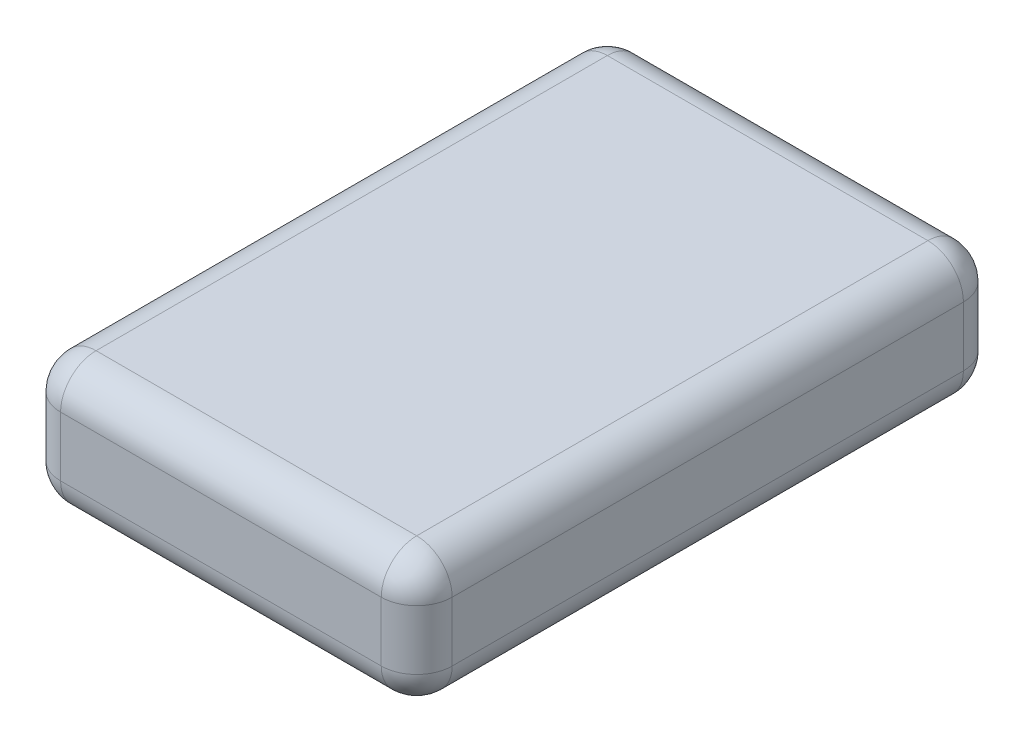
ISO-10303-21;
HEADER;
FILE_DESCRIPTION(('STEP AP214'),'2;1');
FILE_NAME('part.step','',(''),(''),'','','');
FILE_SCHEMA(('AUTOMOTIVE_DESIGN { 1 0 10303 214 1 1 1 1 }'));
ENDSEC;
DATA;
#1=APPLICATION_CONTEXT('core data for automotive mechanical design processes');
#2=APPLICATION_PROTOCOL_DEFINITION('international standard','automotive_design',2000,#1);
#3=PRODUCT_CONTEXT('',#1,'mechanical');
#4=PRODUCT('Part','Part','',(#3));
#5=PRODUCT_RELATED_PRODUCT_CATEGORY('part','',(#4));
#6=PRODUCT_DEFINITION_FORMATION('','',#4);
#7=PRODUCT_DEFINITION_CONTEXT('part definition',#1,'design');
#8=PRODUCT_DEFINITION('design','',#6,#7);
#9=PRODUCT_DEFINITION_SHAPE('','',#8);
#10=(LENGTH_UNIT() NAMED_UNIT(*) SI_UNIT(.MILLI.,.METRE.));
#11=(NAMED_UNIT(*) PLANE_ANGLE_UNIT() SI_UNIT($,.RADIAN.));
#12=(NAMED_UNIT(*) SI_UNIT($,.STERADIAN.) SOLID_ANGLE_UNIT());
#13=UNCERTAINTY_MEASURE_WITH_UNIT(LENGTH_MEASURE(1.E-05),#10,'distance_accuracy_value','');
#14=(GEOMETRIC_REPRESENTATION_CONTEXT(3) GLOBAL_UNCERTAINTY_ASSIGNED_CONTEXT((#13)) GLOBAL_UNIT_ASSIGNED_CONTEXT((#10,
#11,#12)) REPRESENTATION_CONTEXT('',''));
#15=CARTESIAN_POINT('',(0.,0.,0.));
#16=DIRECTION('',(0.,0.,1.));
#17=DIRECTION('',(1.,0.,0.));
#18=AXIS2_PLACEMENT_3D('',#15,#16,#17);
#19=CARTESIAN_POINT('',(8.28,5.52,12.31));
#20=DIRECTION('',(-1.,0.,0.));
#21=DIRECTION('',(0.,0.,1.));
#22=AXIS2_PLACEMENT_3D('',#19,#20,#21);
#23=PLANE('',#22);
#24=DIRECTION('',(0.,-1.,0.));
#25=VECTOR('',#24,1.);
#26=CARTESIAN_POINT('',(8.28,5.52,10.81));
#27=LINE('',#26,#25);
#28=CARTESIAN_POINT('',(8.28,4.02,10.81));
#29=VERTEX_POINT('',#28);
#30=CARTESIAN_POINT('',(8.28,1.5,10.81));
#31=VERTEX_POINT('',#30);
#32=EDGE_CURVE('E329',#29,#31,#27,.T.);
#33=ORIENTED_EDGE('',*,*,#32,.T.);
#34=DIRECTION('',(0.,0.,-1.));
#35=VECTOR('',#34,1.);
#36=CARTESIAN_POINT('',(8.28,1.5,-12.31));
#37=LINE('',#36,#35);
#38=CARTESIAN_POINT('',(8.28,1.5,-10.81));
#39=VERTEX_POINT('',#38);
#40=EDGE_CURVE('E241',#31,#39,#37,.T.);
#41=ORIENTED_EDGE('',*,*,#40,.T.);
#42=DIRECTION('',(0.,-1.,0.));
#43=VECTOR('',#42,1.);
#44=CARTESIAN_POINT('',(8.28,5.52,-10.81));
#45=LINE('',#44,#43);
#46=CARTESIAN_POINT('',(8.28,4.02,-10.81));
#47=VERTEX_POINT('',#46);
#48=EDGE_CURVE('E335',#39,#47,#45,.F.);
#49=ORIENTED_EDGE('',*,*,#48,.T.);
#50=DIRECTION('',(0.,0.,-1.));
#51=VECTOR('',#50,1.);
#52=CARTESIAN_POINT('',(8.28,4.02,12.31));
#53=LINE('',#52,#51);
#54=EDGE_CURVE('E324',#47,#29,#53,.F.);
#55=ORIENTED_EDGE('',*,*,#54,.T.);
#56=EDGE_LOOP('',(#33,#41,#49,#55));
#57=FACE_BOUND('',#56,.T.);
#58=ADVANCED_FACE('F38',(#57),#23,.F.);
#59=CARTESIAN_POINT('',(-8.28,5.52,-12.31));
#60=DIRECTION('',(0.,0.,1.));
#61=DIRECTION('',(1.,0.,0.));
#62=AXIS2_PLACEMENT_3D('',#59,#60,#61);
#63=PLANE('',#62);
#64=DIRECTION('',(0.,-1.,0.));
#65=VECTOR('',#64,1.);
#66=CARTESIAN_POINT('',(6.78,5.52,-12.31));
#67=LINE('',#66,#65);
#68=CARTESIAN_POINT('',(6.78,4.02,-12.31));
#69=VERTEX_POINT('',#68);
#70=CARTESIAN_POINT('',(6.78,1.5,-12.31));
#71=VERTEX_POINT('',#70);
#72=EDGE_CURVE('E138',#69,#71,#67,.T.);
#73=ORIENTED_EDGE('',*,*,#72,.T.);
#74=DIRECTION('',(-1.,0.,0.));
#75=VECTOR('',#74,1.);
#76=CARTESIAN_POINT('',(-8.28,1.5,-12.31));
#77=LINE('',#76,#75);
#78=CARTESIAN_POINT('',(-6.78,1.5,-12.31));
#79=VERTEX_POINT('',#78);
#80=EDGE_CURVE('E133',#71,#79,#77,.T.);
#81=ORIENTED_EDGE('',*,*,#80,.T.);
#82=DIRECTION('',(0.,-1.,0.));
#83=VECTOR('',#82,1.);
#84=CARTESIAN_POINT('',(-6.78,5.52,-12.31));
#85=LINE('',#84,#83);
#86=CARTESIAN_POINT('',(-6.78,4.02,-12.31));
#87=VERTEX_POINT('',#86);
#88=EDGE_CURVE('E127',#79,#87,#85,.F.);
#89=ORIENTED_EDGE('',*,*,#88,.T.);
#90=DIRECTION('',(-1.,0.,0.));
#91=VECTOR('',#90,1.);
#92=CARTESIAN_POINT('',(-8.28,4.02,-12.31));
#93=LINE('',#92,#91);
#94=EDGE_CURVE('E130',#87,#69,#93,.F.);
#95=ORIENTED_EDGE('',*,*,#94,.T.);
#96=EDGE_LOOP('',(#73,#81,#89,#95));
#97=FACE_BOUND('',#96,.T.);
#98=ADVANCED_FACE('F129',(#97),#63,.F.);
#99=CARTESIAN_POINT('',(-8.28,5.52,12.31));
#100=DIRECTION('',(1.,0.,0.));
#101=DIRECTION('',(0.,0.,-1.));
#102=AXIS2_PLACEMENT_3D('',#99,#100,#101);
#103=PLANE('',#102);
#104=DIRECTION('',(0.,0.,1.));
#105=VECTOR('',#104,1.);
#106=CARTESIAN_POINT('',(-8.28,1.5,12.31));
#107=LINE('',#106,#105);
#108=CARTESIAN_POINT('',(-8.28,1.5,-10.81));
#109=VERTEX_POINT('',#108);
#110=CARTESIAN_POINT('',(-8.28,1.5,10.81));
#111=VERTEX_POINT('',#110);
#112=EDGE_CURVE('E256',#109,#111,#107,.T.);
#113=ORIENTED_EDGE('',*,*,#112,.T.);
#114=DIRECTION('',(0.,-1.,0.));
#115=VECTOR('',#114,1.);
#116=CARTESIAN_POINT('',(-8.28,5.52,10.81));
#117=LINE('',#116,#115);
#118=CARTESIAN_POINT('',(-8.28,4.02,10.81));
#119=VERTEX_POINT('',#118);
#120=EDGE_CURVE('E267',#111,#119,#117,.F.);
#121=ORIENTED_EDGE('',*,*,#120,.T.);
#122=DIRECTION('',(0.,0.,1.));
#123=VECTOR('',#122,1.);
#124=CARTESIAN_POINT('',(-8.28,4.02,12.31));
#125=LINE('',#124,#123);
#126=CARTESIAN_POINT('',(-8.28,4.02,-10.81));
#127=VERTEX_POINT('',#126);
#128=EDGE_CURVE('E264',#119,#127,#125,.F.);
#129=ORIENTED_EDGE('',*,*,#128,.T.);
#130=DIRECTION('',(0.,-1.,0.));
#131=VECTOR('',#130,1.);
#132=CARTESIAN_POINT('',(-8.28,5.52,-10.81));
#133=LINE('',#132,#131);
#134=EDGE_CURVE('E161',#127,#109,#133,.T.);
#135=ORIENTED_EDGE('',*,*,#134,.T.);
#136=EDGE_LOOP('',(#113,#121,#129,#135));
#137=FACE_BOUND('',#136,.T.);
#138=ADVANCED_FACE('F368',(#137),#103,.F.);
#139=CARTESIAN_POINT('',(-8.28,5.52,12.31));
#140=DIRECTION('',(0.,0.,-1.));
#141=DIRECTION('',(-1.,0.,0.));
#142=AXIS2_PLACEMENT_3D('',#139,#140,#141);
#143=PLANE('',#142);
#144=DIRECTION('',(0.,-1.,0.));
#145=VECTOR('',#144,1.);
#146=CARTESIAN_POINT('',(-6.78,5.52,12.31));
#147=LINE('',#146,#145);
#148=CARTESIAN_POINT('',(-6.78,4.02,12.31));
#149=VERTEX_POINT('',#148);
#150=CARTESIAN_POINT('',(-6.78,1.5,12.31));
#151=VERTEX_POINT('',#150);
#152=EDGE_CURVE('E240',#149,#151,#147,.T.);
#153=ORIENTED_EDGE('',*,*,#152,.T.);
#154=DIRECTION('',(1.,0.,0.));
#155=VECTOR('',#154,1.);
#156=CARTESIAN_POINT('',(8.28,1.5,12.31));
#157=LINE('',#156,#155);
#158=CARTESIAN_POINT('',(6.78,1.5,12.31));
#159=VERTEX_POINT('',#158);
#160=EDGE_CURVE('E247',#151,#159,#157,.T.);
#161=ORIENTED_EDGE('',*,*,#160,.T.);
#162=DIRECTION('',(0.,-1.,0.));
#163=VECTOR('',#162,1.);
#164=CARTESIAN_POINT('',(6.78,5.52,12.31));
#165=LINE('',#164,#163);
#166=CARTESIAN_POINT('',(6.78,4.02,12.31));
#167=VERTEX_POINT('',#166);
#168=EDGE_CURVE('E244',#159,#167,#165,.F.);
#169=ORIENTED_EDGE('',*,*,#168,.T.);
#170=DIRECTION('',(1.,0.,0.));
#171=VECTOR('',#170,1.);
#172=CARTESIAN_POINT('',(-8.28,4.02,12.31));
#173=LINE('',#172,#171);
#174=EDGE_CURVE('E236',#167,#149,#173,.F.);
#175=ORIENTED_EDGE('',*,*,#174,.T.);
#176=EDGE_LOOP('',(#153,#161,#169,#175));
#177=FACE_BOUND('',#176,.T.);
#178=ADVANCED_FACE('F245',(#177),#143,.F.);
#179=CARTESIAN_POINT('',(0.,5.52,0.));
#180=DIRECTION('',(0.,-1.,0.));
#181=DIRECTION('',(0.,0.,-1.));
#182=AXIS2_PLACEMENT_3D('',#179,#180,#181);
#183=PLANE('',#182);
#184=DIRECTION('',(-1.,0.,0.));
#185=VECTOR('',#184,1.);
#186=CARTESIAN_POINT('',(0.,5.52,-10.81));
#187=LINE('',#186,#185);
#188=CARTESIAN_POINT('',(6.78,5.52,-10.81));
#189=VERTEX_POINT('',#188);
#190=CARTESIAN_POINT('',(-6.78,5.52,-10.81));
#191=VERTEX_POINT('',#190);
#192=EDGE_CURVE('E48',#189,#191,#187,.T.);
#193=ORIENTED_EDGE('',*,*,#192,.T.);
#194=DIRECTION('',(0.,0.,1.));
#195=VECTOR('',#194,1.);
#196=CARTESIAN_POINT('',(-6.78,5.52,0.));
#197=LINE('',#196,#195);
#198=CARTESIAN_POINT('',(-6.78,5.52,10.81));
#199=VERTEX_POINT('',#198);
#200=EDGE_CURVE('E11',#191,#199,#197,.T.);
#201=ORIENTED_EDGE('',*,*,#200,.T.);
#202=DIRECTION('',(1.,0.,0.));
#203=VECTOR('',#202,1.);
#204=CARTESIAN_POINT('',(0.,5.52,10.81));
#205=LINE('',#204,#203);
#206=CARTESIAN_POINT('',(6.78,5.52,10.81));
#207=VERTEX_POINT('',#206);
#208=EDGE_CURVE('E271',#199,#207,#205,.T.);
#209=ORIENTED_EDGE('',*,*,#208,.T.);
#210=DIRECTION('',(0.,0.,-1.));
#211=VECTOR('',#210,1.);
#212=CARTESIAN_POINT('',(6.78,5.52,0.));
#213=LINE('',#212,#211);
#214=EDGE_CURVE('E59',#207,#189,#213,.T.);
#215=ORIENTED_EDGE('',*,*,#214,.T.);
#216=EDGE_LOOP('',(#193,#201,#209,#215));
#217=FACE_BOUND('',#216,.T.);
#218=ADVANCED_FACE('F439',(#217),#183,.F.);
#219=CARTESIAN_POINT('',(0.,0.,0.));
#220=DIRECTION('',(0.,-1.,0.));
#221=DIRECTION('',(0.,0.,-1.));
#222=AXIS2_PLACEMENT_3D('',#219,#220,#221);
#223=PLANE('',#222);
#224=DIRECTION('',(0.,0.,1.));
#225=VECTOR('',#224,1.);
#226=CARTESIAN_POINT('',(-6.78,0.,-12.31));
#227=LINE('',#226,#225);
#228=CARTESIAN_POINT('',(-6.78,0.,10.81));
#229=VERTEX_POINT('',#228);
#230=CARTESIAN_POINT('',(-6.78,0.,-10.81));
#231=VERTEX_POINT('',#230);
#232=EDGE_CURVE('E313',#229,#231,#227,.F.);
#233=ORIENTED_EDGE('',*,*,#232,.T.);
#234=DIRECTION('',(-1.,0.,0.));
#235=VECTOR('',#234,1.);
#236=CARTESIAN_POINT('',(8.28,0.,-10.81));
#237=LINE('',#236,#235);
#238=CARTESIAN_POINT('',(6.78,0.,-10.81));
#239=VERTEX_POINT('',#238);
#240=EDGE_CURVE('E317',#231,#239,#237,.F.);
#241=ORIENTED_EDGE('',*,*,#240,.T.);
#242=DIRECTION('',(0.,0.,-1.));
#243=VECTOR('',#242,1.);
#244=CARTESIAN_POINT('',(6.78,0.,12.31));
#245=LINE('',#244,#243);
#246=CARTESIAN_POINT('',(6.78,0.,10.81));
#247=VERTEX_POINT('',#246);
#248=EDGE_CURVE('E306',#239,#247,#245,.F.);
#249=ORIENTED_EDGE('',*,*,#248,.T.);
#250=DIRECTION('',(1.,0.,0.));
#251=VECTOR('',#250,1.);
#252=CARTESIAN_POINT('',(-8.28,0.,10.81));
#253=LINE('',#252,#251);
#254=EDGE_CURVE('E314',#247,#229,#253,.F.);
#255=ORIENTED_EDGE('',*,*,#254,.T.);
#256=EDGE_LOOP('',(#233,#241,#249,#255));
#257=FACE_BOUND('',#256,.T.);
#258=ADVANCED_FACE('F318',(#257),#223,.T.);
#259=CARTESIAN_POINT('',(0.,4.02,10.81));
#260=DIRECTION('',(1.,0.,0.));
#261=DIRECTION('',(0.,0.,-1.));
#262=AXIS2_PLACEMENT_3D('',#259,#260,#261);
#263=CYLINDRICAL_SURFACE('',#262,1.5);
#264=CARTESIAN_POINT('',(6.78,4.02,10.81));
#265=DIRECTION('',(1.,0.,0.));
#266=DIRECTION('',(0.,0.,-1.));
#267=AXIS2_PLACEMENT_3D('',#264,#265,#266);
#268=CIRCLE('',#267,1.5);
#269=EDGE_CURVE('E42',#207,#167,#268,.T.);
#270=ORIENTED_EDGE('',*,*,#269,.F.);
#271=ORIENTED_EDGE('',*,*,#208,.F.);
#272=CARTESIAN_POINT('',(-6.78,4.02,10.81));
#273=DIRECTION('',(-1.,0.,0.));
#274=DIRECTION('',(0.,0.,1.));
#275=AXIS2_PLACEMENT_3D('',#272,#273,#274);
#276=CIRCLE('',#275,1.5);
#277=EDGE_CURVE('E216',#149,#199,#276,.T.);
#278=ORIENTED_EDGE('',*,*,#277,.F.);
#279=ORIENTED_EDGE('',*,*,#174,.F.);
#280=EDGE_LOOP('',(#270,#271,#278,#279));
#281=FACE_BOUND('',#280,.T.);
#282=ADVANCED_FACE('F40',(#281),#263,.T.);
#283=CARTESIAN_POINT('',(6.78,4.02,10.81));
#284=DIRECTION('',(0.,0.,1.));
#285=DIRECTION('',(1.,0.,0.));
#286=AXIS2_PLACEMENT_3D('',#283,#284,#285);
#287=SPHERICAL_SURFACE('',#286,1.5);
#288=CARTESIAN_POINT('',(6.78,4.02,10.81));
#289=DIRECTION('',(0.,0.,1.));
#290=DIRECTION('',(1.,0.,0.));
#291=AXIS2_PLACEMENT_3D('',#288,#289,#290);
#292=CIRCLE('',#291,1.5);
#293=EDGE_CURVE('E210',#207,#29,#292,.F.);
#294=ORIENTED_EDGE('',*,*,#293,.F.);
#295=ORIENTED_EDGE('',*,*,#269,.T.);
#296=CARTESIAN_POINT('',(6.78,4.02,10.81));
#297=DIRECTION('',(0.,1.,0.));
#298=DIRECTION('',(0.,0.,1.));
#299=AXIS2_PLACEMENT_3D('',#296,#297,#298);
#300=CIRCLE('',#299,1.5);
#301=EDGE_CURVE('E214',#29,#167,#300,.F.);
#302=ORIENTED_EDGE('',*,*,#301,.F.);
#303=EDGE_LOOP('',(#294,#295,#302));
#304=FACE_BOUND('',#303,.T.);
#305=ADVANCED_FACE('F233',(#304),#287,.T.);
#306=CARTESIAN_POINT('',(-6.78,4.02,10.81));
#307=DIRECTION('',(0.,1.,0.));
#308=DIRECTION('',(0.,0.,1.));
#309=AXIS2_PLACEMENT_3D('',#306,#307,#308);
#310=SPHERICAL_SURFACE('',#309,1.5);
#311=CARTESIAN_POINT('',(-6.78,4.02,10.81));
#312=DIRECTION('',(0.,1.,0.));
#313=DIRECTION('',(0.,0.,1.));
#314=AXIS2_PLACEMENT_3D('',#311,#312,#313);
#315=CIRCLE('',#314,1.5);
#316=EDGE_CURVE('E203',#149,#119,#315,.F.);
#317=ORIENTED_EDGE('',*,*,#316,.F.);
#318=ORIENTED_EDGE('',*,*,#277,.T.);
#319=CARTESIAN_POINT('',(-6.78,4.02,10.81));
#320=DIRECTION('',(0.,0.,1.));
#321=DIRECTION('',(1.,0.,0.));
#322=AXIS2_PLACEMENT_3D('',#319,#320,#321);
#323=CIRCLE('',#322,1.5);
#324=EDGE_CURVE('E207',#119,#199,#323,.F.);
#325=ORIENTED_EDGE('',*,*,#324,.F.);
#326=EDGE_LOOP('',(#317,#318,#325));
#327=FACE_BOUND('',#326,.T.);
#328=ADVANCED_FACE('F361',(#327),#310,.T.);
#329=CARTESIAN_POINT('',(6.78,5.52,10.81));
#330=DIRECTION('',(0.,-1.,0.));
#331=DIRECTION('',(0.,0.,-1.));
#332=AXIS2_PLACEMENT_3D('',#329,#330,#331);
#333=CYLINDRICAL_SURFACE('',#332,1.5);
#334=ORIENTED_EDGE('',*,*,#301,.T.);
#335=ORIENTED_EDGE('',*,*,#168,.F.);
#336=CARTESIAN_POINT('',(6.78,1.5,10.81));
#337=DIRECTION('',(0.,-1.,0.));
#338=DIRECTION('',(0.,0.,-1.));
#339=AXIS2_PLACEMENT_3D('',#336,#337,#338);
#340=CIRCLE('',#339,1.5);
#341=EDGE_CURVE('E195',#31,#159,#340,.T.);
#342=ORIENTED_EDGE('',*,*,#341,.F.);
#343=ORIENTED_EDGE('',*,*,#32,.F.);
#344=EDGE_LOOP('',(#334,#335,#342,#343));
#345=FACE_BOUND('',#344,.T.);
#346=ADVANCED_FACE('F353',(#345),#333,.T.);
#347=CARTESIAN_POINT('',(6.78,4.02,0.));
#348=DIRECTION('',(0.,0.,-1.));
#349=DIRECTION('',(-1.,0.,0.));
#350=AXIS2_PLACEMENT_3D('',#347,#348,#349);
#351=CYLINDRICAL_SURFACE('',#350,1.5);
#352=ORIENTED_EDGE('',*,*,#293,.T.);
#353=ORIENTED_EDGE('',*,*,#54,.F.);
#354=CARTESIAN_POINT('',(6.78,4.02,-10.81));
#355=DIRECTION('',(0.,0.,-1.));
#356=DIRECTION('',(-1.,0.,0.));
#357=AXIS2_PLACEMENT_3D('',#354,#355,#356);
#358=CIRCLE('',#357,1.5);
#359=EDGE_CURVE('E191',#189,#47,#358,.T.);
#360=ORIENTED_EDGE('',*,*,#359,.F.);
#361=ORIENTED_EDGE('',*,*,#214,.F.);
#362=EDGE_LOOP('',(#352,#353,#360,#361));
#363=FACE_BOUND('',#362,.T.);
#364=ADVANCED_FACE('F351',(#363),#351,.T.);
#365=CARTESIAN_POINT('',(0.,4.02,-10.81));
#366=DIRECTION('',(-1.,0.,0.));
#367=DIRECTION('',(0.,0.,1.));
#368=AXIS2_PLACEMENT_3D('',#365,#366,#367);
#369=CYLINDRICAL_SURFACE('',#368,1.5);
#370=CARTESIAN_POINT('',(-6.78,4.02,-10.81));
#371=DIRECTION('',(-1.,0.,0.));
#372=DIRECTION('',(0.,0.,1.));
#373=AXIS2_PLACEMENT_3D('',#370,#371,#372);
#374=CIRCLE('',#373,1.5);
#375=EDGE_CURVE('E144',#191,#87,#374,.T.);
#376=ORIENTED_EDGE('',*,*,#375,.F.);
#377=ORIENTED_EDGE('',*,*,#192,.F.);
#378=CARTESIAN_POINT('',(6.78,4.02,-10.81));
#379=DIRECTION('',(1.,0.,0.));
#380=DIRECTION('',(0.,0.,-1.));
#381=AXIS2_PLACEMENT_3D('',#378,#379,#380);
#382=CIRCLE('',#381,1.5);
#383=EDGE_CURVE('E147',#69,#189,#382,.T.);
#384=ORIENTED_EDGE('',*,*,#383,.F.);
#385=ORIENTED_EDGE('',*,*,#94,.F.);
#386=EDGE_LOOP('',(#376,#377,#384,#385));
#387=FACE_BOUND('',#386,.T.);
#388=ADVANCED_FACE('F143',(#387),#369,.T.);
#389=CARTESIAN_POINT('',(-6.78,4.02,0.));
#390=DIRECTION('',(0.,0.,1.));
#391=DIRECTION('',(1.,0.,0.));
#392=AXIS2_PLACEMENT_3D('',#389,#390,#391);
#393=CYLINDRICAL_SURFACE('',#392,1.5);
#394=ORIENTED_EDGE('',*,*,#324,.T.);
#395=ORIENTED_EDGE('',*,*,#200,.F.);
#396=CARTESIAN_POINT('',(-6.78,4.02,-10.81));
#397=DIRECTION('',(0.,0.,-1.));
#398=DIRECTION('',(0.,1.,0.));
#399=AXIS2_PLACEMENT_3D('',#396,#397,#398);
#400=CIRCLE('',#399,1.5);
#401=EDGE_CURVE('E157',#127,#191,#400,.T.);
#402=ORIENTED_EDGE('',*,*,#401,.F.);
#403=ORIENTED_EDGE('',*,*,#128,.F.);
#404=EDGE_LOOP('',(#394,#395,#402,#403));
#405=FACE_BOUND('',#404,.T.);
#406=ADVANCED_FACE('F359',(#405),#393,.T.);
#407=CARTESIAN_POINT('',(-6.78,5.52,10.81));
#408=DIRECTION('',(0.,-1.,0.));
#409=DIRECTION('',(0.,0.,-1.));
#410=AXIS2_PLACEMENT_3D('',#407,#408,#409);
#411=CYLINDRICAL_SURFACE('',#410,1.5);
#412=ORIENTED_EDGE('',*,*,#316,.T.);
#413=ORIENTED_EDGE('',*,*,#120,.F.);
#414=CARTESIAN_POINT('',(-6.78,1.5,10.81));
#415=DIRECTION('',(0.,-1.,0.));
#416=DIRECTION('',(0.,0.,-1.));
#417=AXIS2_PLACEMENT_3D('',#414,#415,#416);
#418=CIRCLE('',#417,1.5);
#419=EDGE_CURVE('E183',#151,#111,#418,.T.);
#420=ORIENTED_EDGE('',*,*,#419,.F.);
#421=ORIENTED_EDGE('',*,*,#152,.F.);
#422=EDGE_LOOP('',(#412,#413,#420,#421));
#423=FACE_BOUND('',#422,.T.);
#424=ADVANCED_FACE('F406',(#423),#411,.T.);
#425=CARTESIAN_POINT('',(-8.28,1.5,10.81));
#426=DIRECTION('',(-1.,0.,0.));
#427=DIRECTION('',(0.,0.,1.));
#428=AXIS2_PLACEMENT_3D('',#425,#426,#427);
#429=CYLINDRICAL_SURFACE('',#428,1.5);
#430=CARTESIAN_POINT('',(6.78,1.5,10.81));
#431=DIRECTION('',(1.,0.,0.));
#432=DIRECTION('',(0.,0.,-1.));
#433=AXIS2_PLACEMENT_3D('',#430,#431,#432);
#434=CIRCLE('',#433,1.5);
#435=EDGE_CURVE('E199',#159,#247,#434,.T.);
#436=ORIENTED_EDGE('',*,*,#435,.F.);
#437=ORIENTED_EDGE('',*,*,#160,.F.);
#438=CARTESIAN_POINT('',(-6.78,1.5,10.81));
#439=DIRECTION('',(-1.,0.,0.));
#440=DIRECTION('',(0.,0.,1.));
#441=AXIS2_PLACEMENT_3D('',#438,#439,#440);
#442=CIRCLE('',#441,1.5);
#443=EDGE_CURVE('E179',#229,#151,#442,.T.);
#444=ORIENTED_EDGE('',*,*,#443,.F.);
#445=ORIENTED_EDGE('',*,*,#254,.F.);
#446=EDGE_LOOP('',(#436,#437,#444,#445));
#447=FACE_BOUND('',#446,.T.);
#448=ADVANCED_FACE('F402',(#447),#429,.T.);
#449=CARTESIAN_POINT('',(6.78,1.5,10.81));
#450=DIRECTION('',(0.,0.,1.));
#451=DIRECTION('',(0.,-1.,0.));
#452=AXIS2_PLACEMENT_3D('',#449,#450,#451);
#453=SPHERICAL_SURFACE('',#452,1.5);
#454=ORIENTED_EDGE('',*,*,#341,.T.);
#455=ORIENTED_EDGE('',*,*,#435,.T.);
#456=CARTESIAN_POINT('',(6.78,1.5,10.81));
#457=DIRECTION('',(0.,0.,1.));
#458=DIRECTION('',(1.,0.,0.));
#459=AXIS2_PLACEMENT_3D('',#456,#457,#458);
#460=CIRCLE('',#459,1.5);
#461=EDGE_CURVE('E169',#31,#247,#460,.F.);
#462=ORIENTED_EDGE('',*,*,#461,.F.);
#463=EDGE_LOOP('',(#454,#455,#462));
#464=FACE_BOUND('',#463,.T.);
#465=ADVANCED_FACE('F399',(#464),#453,.T.);
#466=CARTESIAN_POINT('',(6.78,4.02,-10.81));
#467=DIRECTION('',(0.,1.,0.));
#468=DIRECTION('',(0.,0.,1.));
#469=AXIS2_PLACEMENT_3D('',#466,#467,#468);
#470=SPHERICAL_SURFACE('',#469,1.5);
#471=ORIENTED_EDGE('',*,*,#383,.T.);
#472=ORIENTED_EDGE('',*,*,#359,.T.);
#473=CARTESIAN_POINT('',(6.78,4.02,-10.81));
#474=DIRECTION('',(0.,1.,0.));
#475=DIRECTION('',(0.,0.,1.));
#476=AXIS2_PLACEMENT_3D('',#473,#474,#475);
#477=CIRCLE('',#476,1.5);
#478=EDGE_CURVE('E163',#69,#47,#477,.F.);
#479=ORIENTED_EDGE('',*,*,#478,.F.);
#480=EDGE_LOOP('',(#471,#472,#479));
#481=FACE_BOUND('',#480,.T.);
#482=ADVANCED_FACE('F349',(#481),#470,.T.);
#483=CARTESIAN_POINT('',(-6.78,4.02,-10.81));
#484=DIRECTION('',(0.,1.,0.));
#485=DIRECTION('',(0.,0.,1.));
#486=AXIS2_PLACEMENT_3D('',#483,#484,#485);
#487=SPHERICAL_SURFACE('',#486,1.5);
#488=ORIENTED_EDGE('',*,*,#401,.T.);
#489=ORIENTED_EDGE('',*,*,#375,.T.);
#490=CARTESIAN_POINT('',(-6.78,4.02,-10.81));
#491=DIRECTION('',(0.,1.,0.));
#492=DIRECTION('',(0.,0.,1.));
#493=AXIS2_PLACEMENT_3D('',#490,#491,#492);
#494=CIRCLE('',#493,1.5);
#495=EDGE_CURVE('E154',#127,#87,#494,.F.);
#496=ORIENTED_EDGE('',*,*,#495,.F.);
#497=EDGE_LOOP('',(#488,#489,#496));
#498=FACE_BOUND('',#497,.T.);
#499=ADVANCED_FACE('F153',(#498),#487,.T.);
#500=CARTESIAN_POINT('',(-6.78,1.5,10.81));
#501=DIRECTION('',(0.,0.,1.));
#502=DIRECTION('',(0.,-1.,0.));
#503=AXIS2_PLACEMENT_3D('',#500,#501,#502);
#504=SPHERICAL_SURFACE('',#503,1.5);
#505=ORIENTED_EDGE('',*,*,#443,.T.);
#506=ORIENTED_EDGE('',*,*,#419,.T.);
#507=CARTESIAN_POINT('',(-6.78,1.5,10.81));
#508=DIRECTION('',(0.,0.,1.));
#509=DIRECTION('',(1.,0.,0.));
#510=AXIS2_PLACEMENT_3D('',#507,#508,#509);
#511=CIRCLE('',#510,1.5);
#512=EDGE_CURVE('E164',#229,#111,#511,.F.);
#513=ORIENTED_EDGE('',*,*,#512,.F.);
#514=EDGE_LOOP('',(#505,#506,#513));
#515=FACE_BOUND('',#514,.T.);
#516=ADVANCED_FACE('F391',(#515),#504,.T.);
#517=CARTESIAN_POINT('',(6.78,1.5,12.31));
#518=DIRECTION('',(0.,0.,1.));
#519=DIRECTION('',(1.,0.,0.));
#520=AXIS2_PLACEMENT_3D('',#517,#518,#519);
#521=CYLINDRICAL_SURFACE('',#520,1.5);
#522=ORIENTED_EDGE('',*,*,#461,.T.);
#523=ORIENTED_EDGE('',*,*,#248,.F.);
#524=CARTESIAN_POINT('',(6.78,1.5,-10.81));
#525=DIRECTION('',(0.,0.,-1.));
#526=DIRECTION('',(-1.,0.,0.));
#527=AXIS2_PLACEMENT_3D('',#524,#525,#526);
#528=CIRCLE('',#527,1.5);
#529=EDGE_CURVE('E172',#39,#239,#528,.T.);
#530=ORIENTED_EDGE('',*,*,#529,.F.);
#531=ORIENTED_EDGE('',*,*,#40,.F.);
#532=EDGE_LOOP('',(#522,#523,#530,#531));
#533=FACE_BOUND('',#532,.T.);
#534=ADVANCED_FACE('F308',(#533),#521,.T.);
#535=CARTESIAN_POINT('',(6.78,5.52,-10.81));
#536=DIRECTION('',(0.,-1.,0.));
#537=DIRECTION('',(0.,0.,-1.));
#538=AXIS2_PLACEMENT_3D('',#535,#536,#537);
#539=CYLINDRICAL_SURFACE('',#538,1.5);
#540=ORIENTED_EDGE('',*,*,#478,.T.);
#541=ORIENTED_EDGE('',*,*,#48,.F.);
#542=CARTESIAN_POINT('',(6.78,1.5,-10.81));
#543=DIRECTION('',(0.,-1.,0.));
#544=DIRECTION('',(0.,0.,-1.));
#545=AXIS2_PLACEMENT_3D('',#542,#543,#544);
#546=CIRCLE('',#545,1.5);
#547=EDGE_CURVE('E292',#71,#39,#546,.T.);
#548=ORIENTED_EDGE('',*,*,#547,.F.);
#549=ORIENTED_EDGE('',*,*,#72,.F.);
#550=EDGE_LOOP('',(#540,#541,#548,#549));
#551=FACE_BOUND('',#550,.T.);
#552=ADVANCED_FACE('F344',(#551),#539,.T.);
#553=CARTESIAN_POINT('',(-6.78,5.52,-10.81));
#554=DIRECTION('',(0.,-1.,0.));
#555=DIRECTION('',(0.,0.,-1.));
#556=AXIS2_PLACEMENT_3D('',#553,#554,#555);
#557=CYLINDRICAL_SURFACE('',#556,1.5);
#558=ORIENTED_EDGE('',*,*,#495,.T.);
#559=ORIENTED_EDGE('',*,*,#88,.F.);
#560=CARTESIAN_POINT('',(-6.78,1.5,-10.81));
#561=DIRECTION('',(0.,-1.,0.));
#562=DIRECTION('',(0.,0.,-1.));
#563=AXIS2_PLACEMENT_3D('',#560,#561,#562);
#564=CIRCLE('',#563,1.5);
#565=EDGE_CURVE('E288',#109,#79,#564,.T.);
#566=ORIENTED_EDGE('',*,*,#565,.F.);
#567=ORIENTED_EDGE('',*,*,#134,.F.);
#568=EDGE_LOOP('',(#558,#559,#566,#567));
#569=FACE_BOUND('',#568,.T.);
#570=ADVANCED_FACE('F160',(#569),#557,.T.);
#571=CARTESIAN_POINT('',(-6.78,1.5,12.31));
#572=DIRECTION('',(0.,0.,-1.));
#573=DIRECTION('',(-1.,0.,0.));
#574=AXIS2_PLACEMENT_3D('',#571,#572,#573);
#575=CYLINDRICAL_SURFACE('',#574,1.5);
#576=ORIENTED_EDGE('',*,*,#512,.T.);
#577=ORIENTED_EDGE('',*,*,#112,.F.);
#578=CARTESIAN_POINT('',(-6.78,1.5,-10.81));
#579=DIRECTION('',(0.,0.,-1.));
#580=DIRECTION('',(-1.,0.,0.));
#581=AXIS2_PLACEMENT_3D('',#578,#579,#580);
#582=CIRCLE('',#581,1.5);
#583=EDGE_CURVE('E284',#231,#109,#582,.T.);
#584=ORIENTED_EDGE('',*,*,#583,.F.);
#585=ORIENTED_EDGE('',*,*,#232,.F.);
#586=EDGE_LOOP('',(#576,#577,#584,#585));
#587=FACE_BOUND('',#586,.T.);
#588=ADVANCED_FACE('F381',(#587),#575,.T.);
#589=CARTESIAN_POINT('',(6.78,1.5,-10.81));
#590=DIRECTION('',(1.,0.,0.));
#591=DIRECTION('',(0.,1.,0.));
#592=AXIS2_PLACEMENT_3D('',#589,#590,#591);
#593=SPHERICAL_SURFACE('',#592,1.5);
#594=ORIENTED_EDGE('',*,*,#547,.T.);
#595=ORIENTED_EDGE('',*,*,#529,.T.);
#596=CARTESIAN_POINT('',(6.78,1.5,-10.81));
#597=DIRECTION('',(1.,0.,0.));
#598=DIRECTION('',(0.,0.,-1.));
#599=AXIS2_PLACEMENT_3D('',#596,#597,#598);
#600=CIRCLE('',#599,1.5);
#601=EDGE_CURVE('E281',#71,#239,#600,.F.);
#602=ORIENTED_EDGE('',*,*,#601,.F.);
#603=EDGE_LOOP('',(#594,#595,#602));
#604=FACE_BOUND('',#603,.T.);
#605=ADVANCED_FACE('F302',(#604),#593,.T.);
#606=CARTESIAN_POINT('',(-6.78,1.5,-10.81));
#607=DIRECTION('',(-1.,0.,0.));
#608=DIRECTION('',(0.,0.,1.));
#609=AXIS2_PLACEMENT_3D('',#606,#607,#608);
#610=SPHERICAL_SURFACE('',#609,1.5);
#611=ORIENTED_EDGE('',*,*,#583,.T.);
#612=ORIENTED_EDGE('',*,*,#565,.T.);
#613=CARTESIAN_POINT('',(-6.78,1.5,-10.81));
#614=DIRECTION('',(-1.,0.,0.));
#615=DIRECTION('',(0.,0.,1.));
#616=AXIS2_PLACEMENT_3D('',#613,#614,#615);
#617=CIRCLE('',#616,1.5);
#618=EDGE_CURVE('E278',#231,#79,#617,.F.);
#619=ORIENTED_EDGE('',*,*,#618,.F.);
#620=EDGE_LOOP('',(#611,#612,#619));
#621=FACE_BOUND('',#620,.T.);
#622=ADVANCED_FACE('F375',(#621),#610,.T.);
#623=CARTESIAN_POINT('',(-8.28,1.5,-10.81));
#624=DIRECTION('',(1.,0.,0.));
#625=DIRECTION('',(0.,0.,-1.));
#626=AXIS2_PLACEMENT_3D('',#623,#624,#625);
#627=CYLINDRICAL_SURFACE('',#626,1.5);
#628=ORIENTED_EDGE('',*,*,#601,.T.);
#629=ORIENTED_EDGE('',*,*,#240,.F.);
#630=ORIENTED_EDGE('',*,*,#618,.T.);
#631=ORIENTED_EDGE('',*,*,#80,.F.);
#632=EDGE_LOOP('',(#628,#629,#630,#631));
#633=FACE_BOUND('',#632,.T.);
#634=ADVANCED_FACE('F372',(#633),#627,.T.);
#635=CLOSED_SHELL('',(#58,#98,#138,#178,#218,#258,#282,#305,#328,#346,#364,#388,#406,#424,#448,
#465,#482,#499,#516,#534,#552,#570,#588,#605,#622,#634));
#636=MANIFOLD_SOLID_BREP('B2',#635);
#637=ADVANCED_BREP_SHAPE_REPRESENTATION('',(#18,#636),#14);
#638=SHAPE_DEFINITION_REPRESENTATION(#9,#637);
ENDSEC;
END-ISO-10303-21;
